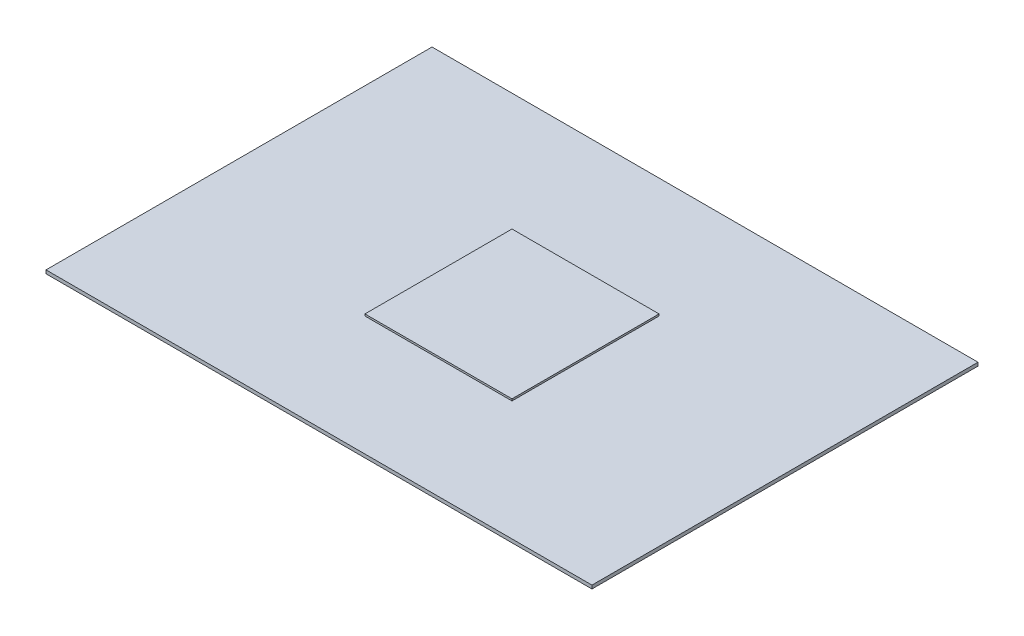
ISO-10303-21;
HEADER;
FILE_DESCRIPTION(('STEP AP214'),'2;1');
FILE_NAME('part.step','',(''),(''),'','','');
FILE_SCHEMA(('AUTOMOTIVE_DESIGN { 1 0 10303 214 1 1 1 1 }'));
ENDSEC;
DATA;
#1=APPLICATION_CONTEXT('core data for automotive mechanical design processes');
#2=APPLICATION_PROTOCOL_DEFINITION('international standard','automotive_design',2000,#1);
#3=PRODUCT_CONTEXT('',#1,'mechanical');
#4=PRODUCT('Part','Part','',(#3));
#5=PRODUCT_RELATED_PRODUCT_CATEGORY('part','',(#4));
#6=PRODUCT_DEFINITION_FORMATION('','',#4);
#7=PRODUCT_DEFINITION_CONTEXT('part definition',#1,'design');
#8=PRODUCT_DEFINITION('design','',#6,#7);
#9=PRODUCT_DEFINITION_SHAPE('','',#8);
#10=(LENGTH_UNIT() NAMED_UNIT(*) SI_UNIT(.MILLI.,.METRE.));
#11=(NAMED_UNIT(*) PLANE_ANGLE_UNIT() SI_UNIT($,.RADIAN.));
#12=(NAMED_UNIT(*) SI_UNIT($,.STERADIAN.) SOLID_ANGLE_UNIT());
#13=UNCERTAINTY_MEASURE_WITH_UNIT(LENGTH_MEASURE(1.E-05),#10,'distance_accuracy_value','');
#14=(GEOMETRIC_REPRESENTATION_CONTEXT(3) GLOBAL_UNCERTAINTY_ASSIGNED_CONTEXT((#13)) GLOBAL_UNIT_ASSIGNED_CONTEXT((#10,
#11,#12)) REPRESENTATION_CONTEXT('',''));
#15=CARTESIAN_POINT('',(0.,0.,0.));
#16=DIRECTION('',(0.,0.,1.));
#17=DIRECTION('',(1.,0.,0.));
#18=AXIS2_PLACEMENT_3D('',#15,#16,#17);
#19=CARTESIAN_POINT('',(0.,1.85176875818718,0.));
#20=DIRECTION('',(0.,-1.,0.));
#21=DIRECTION('',(0.,0.,-1.));
#22=AXIS2_PLACEMENT_3D('',#19,#20,#21);
#23=PLANE('',#22);
#24=DIRECTION('',(0.,0.,-1.));
#25=VECTOR('',#24,1.);
#26=CARTESIAN_POINT('',(148.5,1.85176875818718,105.));
#27=LINE('',#26,#25);
#28=CARTESIAN_POINT('',(148.5,1.85176875818718,105.));
#29=VERTEX_POINT('',#28);
#30=CARTESIAN_POINT('',(148.5,1.85176875818718,-105.));
#31=VERTEX_POINT('',#30);
#32=EDGE_CURVE('E145',#29,#31,#27,.T.);
#33=ORIENTED_EDGE('',*,*,#32,.T.);
#34=DIRECTION('',(-1.,0.,0.));
#35=VECTOR('',#34,1.);
#36=CARTESIAN_POINT('',(-148.5,1.85176875818718,-105.));
#37=LINE('',#36,#35);
#38=CARTESIAN_POINT('',(-148.5,1.85176875818718,-105.));
#39=VERTEX_POINT('',#38);
#40=EDGE_CURVE('E149',#31,#39,#37,.T.);
#41=ORIENTED_EDGE('',*,*,#40,.T.);
#42=DIRECTION('',(0.,0.,1.));
#43=VECTOR('',#42,1.);
#44=CARTESIAN_POINT('',(-148.5,1.85176875818718,105.));
#45=LINE('',#44,#43);
#46=CARTESIAN_POINT('',(-148.5,1.85176875818718,105.));
#47=VERTEX_POINT('',#46);
#48=EDGE_CURVE('E153',#39,#47,#45,.T.);
#49=ORIENTED_EDGE('',*,*,#48,.T.);
#50=DIRECTION('',(1.,0.,0.));
#51=VECTOR('',#50,1.);
#52=CARTESIAN_POINT('',(-148.5,1.85176875818718,105.));
#53=LINE('',#52,#51);
#54=EDGE_CURVE('E156',#47,#29,#53,.T.);
#55=ORIENTED_EDGE('',*,*,#54,.T.);
#56=EDGE_LOOP('',(#33,#41,#49,#55));
#57=FACE_BOUND('',#56,.T.);
#58=DIRECTION('',(0.,0.,-1.));
#59=VECTOR('',#58,1.);
#60=CARTESIAN_POINT('',(40.,1.85176875818718,40.));
#61=LINE('',#60,#59);
#62=CARTESIAN_POINT('',(40.,1.85176875818718,40.));
#63=VERTEX_POINT('',#62);
#64=CARTESIAN_POINT('',(40.,1.85176875818718,-40.));
#65=VERTEX_POINT('',#64);
#66=EDGE_CURVE('E61',#63,#65,#61,.T.);
#67=ORIENTED_EDGE('',*,*,#66,.F.);
#68=DIRECTION('',(1.,0.,0.));
#69=VECTOR('',#68,1.);
#70=CARTESIAN_POINT('',(-40.,1.85176875818718,40.));
#71=LINE('',#70,#69);
#72=CARTESIAN_POINT('',(-40.,1.85176875818718,40.));
#73=VERTEX_POINT('',#72);
#74=EDGE_CURVE('E65',#73,#63,#71,.T.);
#75=ORIENTED_EDGE('',*,*,#74,.F.);
#76=DIRECTION('',(0.,0.,1.));
#77=VECTOR('',#76,1.);
#78=CARTESIAN_POINT('',(-40.,1.85176875818718,40.));
#79=LINE('',#78,#77);
#80=CARTESIAN_POINT('',(-40.,1.85176875818718,-40.));
#81=VERTEX_POINT('',#80);
#82=EDGE_CURVE('E313',#81,#73,#79,.T.);
#83=ORIENTED_EDGE('',*,*,#82,.F.);
#84=DIRECTION('',(-1.,0.,0.));
#85=VECTOR('',#84,1.);
#86=CARTESIAN_POINT('',(-40.,1.85176875818718,-40.));
#87=LINE('',#86,#85);
#88=EDGE_CURVE('E323',#65,#81,#87,.T.);
#89=ORIENTED_EDGE('',*,*,#88,.F.);
#90=EDGE_LOOP('',(#67,#75,#83,#89));
#91=FACE_BOUND('',#90,.T.);
#92=ADVANCED_FACE('F45',(#57,#91),#23,.F.);
#93=CARTESIAN_POINT('',(148.5,1.85176875818718,105.));
#94=DIRECTION('',(-1.,0.,0.));
#95=DIRECTION('',(0.,0.,1.));
#96=AXIS2_PLACEMENT_3D('',#93,#94,#95);
#97=PLANE('',#96);
#98=DIRECTION('',(0.,0.,-1.));
#99=VECTOR('',#98,1.);
#100=CARTESIAN_POINT('',(148.5,0.,105.));
#101=LINE('',#100,#99);
#102=CARTESIAN_POINT('',(148.5,0.,105.));
#103=VERTEX_POINT('',#102);
#104=CARTESIAN_POINT('',(148.5,0.,-105.));
#105=VERTEX_POINT('',#104);
#106=EDGE_CURVE('E134',#103,#105,#101,.T.);
#107=ORIENTED_EDGE('',*,*,#106,.T.);
#108=DIRECTION('',(0.,-1.,0.));
#109=VECTOR('',#108,1.);
#110=CARTESIAN_POINT('',(148.5,1.85176875818718,-105.));
#111=LINE('',#110,#109);
#112=EDGE_CURVE('E11',#31,#105,#111,.T.);
#113=ORIENTED_EDGE('',*,*,#112,.F.);
#114=ORIENTED_EDGE('',*,*,#32,.F.);
#115=DIRECTION('',(0.,-1.,0.));
#116=VECTOR('',#115,1.);
#117=CARTESIAN_POINT('',(148.5,1.85176875818718,105.));
#118=LINE('',#117,#116);
#119=EDGE_CURVE('E158',#29,#103,#118,.T.);
#120=ORIENTED_EDGE('',*,*,#119,.T.);
#121=EDGE_LOOP('',(#107,#113,#114,#120));
#122=FACE_BOUND('',#121,.T.);
#123=ADVANCED_FACE('F47',(#122),#97,.F.);
#124=CARTESIAN_POINT('',(-148.5,1.85176875818718,-105.));
#125=DIRECTION('',(0.,0.,1.));
#126=DIRECTION('',(1.,0.,0.));
#127=AXIS2_PLACEMENT_3D('',#124,#125,#126);
#128=PLANE('',#127);
#129=DIRECTION('',(-1.,0.,0.));
#130=VECTOR('',#129,1.);
#131=CARTESIAN_POINT('',(-148.5,0.,-105.));
#132=LINE('',#131,#130);
#133=CARTESIAN_POINT('',(-148.5,0.,-105.));
#134=VERTEX_POINT('',#133);
#135=EDGE_CURVE('E139',#105,#134,#132,.T.);
#136=ORIENTED_EDGE('',*,*,#135,.T.);
#137=DIRECTION('',(0.,-1.,0.));
#138=VECTOR('',#137,1.);
#139=CARTESIAN_POINT('',(-148.5,1.85176875818718,-105.));
#140=LINE('',#139,#138);
#141=EDGE_CURVE('E54',#39,#134,#140,.T.);
#142=ORIENTED_EDGE('',*,*,#141,.F.);
#143=ORIENTED_EDGE('',*,*,#40,.F.);
#144=ORIENTED_EDGE('',*,*,#112,.T.);
#145=EDGE_LOOP('',(#136,#142,#143,#144));
#146=FACE_BOUND('',#145,.T.);
#147=ADVANCED_FACE('F194',(#146),#128,.F.);
#148=CARTESIAN_POINT('',(-148.5,1.85176875818718,105.));
#149=DIRECTION('',(1.,0.,0.));
#150=DIRECTION('',(0.,0.,-1.));
#151=AXIS2_PLACEMENT_3D('',#148,#149,#150);
#152=PLANE('',#151);
#153=DIRECTION('',(0.,0.,1.));
#154=VECTOR('',#153,1.);
#155=CARTESIAN_POINT('',(-148.5,0.,105.));
#156=LINE('',#155,#154);
#157=CARTESIAN_POINT('',(-148.5,0.,105.));
#158=VERTEX_POINT('',#157);
#159=EDGE_CURVE('E162',#134,#158,#156,.T.);
#160=ORIENTED_EDGE('',*,*,#159,.T.);
#161=DIRECTION('',(0.,-1.,0.));
#162=VECTOR('',#161,1.);
#163=CARTESIAN_POINT('',(-148.5,1.85176875818718,105.));
#164=LINE('',#163,#162);
#165=EDGE_CURVE('E170',#47,#158,#164,.T.);
#166=ORIENTED_EDGE('',*,*,#165,.F.);
#167=ORIENTED_EDGE('',*,*,#48,.F.);
#168=ORIENTED_EDGE('',*,*,#141,.T.);
#169=EDGE_LOOP('',(#160,#166,#167,#168));
#170=FACE_BOUND('',#169,.T.);
#171=ADVANCED_FACE('F179',(#170),#152,.F.);
#172=CARTESIAN_POINT('',(-148.5,1.85176875818718,105.));
#173=DIRECTION('',(0.,0.,-1.));
#174=DIRECTION('',(-1.,0.,0.));
#175=AXIS2_PLACEMENT_3D('',#172,#173,#174);
#176=PLANE('',#175);
#177=DIRECTION('',(1.,0.,0.));
#178=VECTOR('',#177,1.);
#179=CARTESIAN_POINT('',(-148.5,0.,105.));
#180=LINE('',#179,#178);
#181=EDGE_CURVE('E150',#158,#103,#180,.T.);
#182=ORIENTED_EDGE('',*,*,#181,.T.);
#183=ORIENTED_EDGE('',*,*,#119,.F.);
#184=ORIENTED_EDGE('',*,*,#54,.F.);
#185=ORIENTED_EDGE('',*,*,#165,.T.);
#186=EDGE_LOOP('',(#182,#183,#184,#185));
#187=FACE_BOUND('',#186,.T.);
#188=ADVANCED_FACE('F188',(#187),#176,.F.);
#189=CARTESIAN_POINT('',(0.,0.,0.));
#190=DIRECTION('',(0.,-1.,0.));
#191=DIRECTION('',(0.,0.,-1.));
#192=AXIS2_PLACEMENT_3D('',#189,#190,#191);
#193=PLANE('',#192);
#194=ORIENTED_EDGE('',*,*,#106,.F.);
#195=ORIENTED_EDGE('',*,*,#181,.F.);
#196=ORIENTED_EDGE('',*,*,#159,.F.);
#197=ORIENTED_EDGE('',*,*,#135,.F.);
#198=EDGE_LOOP('',(#194,#195,#196,#197));
#199=FACE_BOUND('',#198,.T.);
#200=ADVANCED_FACE('F185',(#199),#193,.T.);
#201=CARTESIAN_POINT('',(40.,2.85176875818718,40.));
#202=DIRECTION('',(-1.,0.,0.));
#203=DIRECTION('',(0.,0.,1.));
#204=AXIS2_PLACEMENT_3D('',#201,#202,#203);
#205=PLANE('',#204);
#206=ORIENTED_EDGE('',*,*,#66,.T.);
#207=DIRECTION('',(0.,-1.,0.));
#208=VECTOR('',#207,1.);
#209=CARTESIAN_POINT('',(40.,2.85176875818718,-40.));
#210=LINE('',#209,#208);
#211=CARTESIAN_POINT('',(40.,2.85176875818718,-40.));
#212=VERTEX_POINT('',#211);
#213=EDGE_CURVE('E114',#212,#65,#210,.T.);
#214=ORIENTED_EDGE('',*,*,#213,.F.);
#215=DIRECTION('',(0.,0.,-1.));
#216=VECTOR('',#215,1.);
#217=CARTESIAN_POINT('',(40.,2.85176875818718,40.));
#218=LINE('',#217,#216);
#219=CARTESIAN_POINT('',(40.,2.85176875818718,40.));
#220=VERTEX_POINT('',#219);
#221=EDGE_CURVE('E121',#220,#212,#218,.T.);
#222=ORIENTED_EDGE('',*,*,#221,.F.);
#223=DIRECTION('',(0.,-1.,0.));
#224=VECTOR('',#223,1.);
#225=CARTESIAN_POINT('',(40.,2.85176875818718,40.));
#226=LINE('',#225,#224);
#227=EDGE_CURVE('E310',#220,#63,#226,.T.);
#228=ORIENTED_EDGE('',*,*,#227,.T.);
#229=EDGE_LOOP('',(#206,#214,#222,#228));
#230=FACE_BOUND('',#229,.T.);
#231=ADVANCED_FACE('F132',(#230),#205,.F.);
#232=CARTESIAN_POINT('',(-40.,2.85176875818718,-40.));
#233=DIRECTION('',(0.,0.,1.));
#234=DIRECTION('',(1.,0.,0.));
#235=AXIS2_PLACEMENT_3D('',#232,#233,#234);
#236=PLANE('',#235);
#237=ORIENTED_EDGE('',*,*,#88,.T.);
#238=DIRECTION('',(0.,-1.,0.));
#239=VECTOR('',#238,1.);
#240=CARTESIAN_POINT('',(-40.,2.85176875818718,-40.));
#241=LINE('',#240,#239);
#242=CARTESIAN_POINT('',(-40.,2.85176875818718,-40.));
#243=VERTEX_POINT('',#242);
#244=EDGE_CURVE('E116',#243,#81,#241,.T.);
#245=ORIENTED_EDGE('',*,*,#244,.F.);
#246=DIRECTION('',(-1.,0.,0.));
#247=VECTOR('',#246,1.);
#248=CARTESIAN_POINT('',(-40.,2.85176875818718,-40.));
#249=LINE('',#248,#247);
#250=EDGE_CURVE('E109',#212,#243,#249,.T.);
#251=ORIENTED_EDGE('',*,*,#250,.F.);
#252=ORIENTED_EDGE('',*,*,#213,.T.);
#253=EDGE_LOOP('',(#237,#245,#251,#252));
#254=FACE_BOUND('',#253,.T.);
#255=ADVANCED_FACE('F112',(#254),#236,.F.);
#256=CARTESIAN_POINT('',(-40.,2.85176875818718,40.));
#257=DIRECTION('',(1.,0.,0.));
#258=DIRECTION('',(0.,0.,-1.));
#259=AXIS2_PLACEMENT_3D('',#256,#257,#258);
#260=PLANE('',#259);
#261=ORIENTED_EDGE('',*,*,#82,.T.);
#262=DIRECTION('',(0.,-1.,0.));
#263=VECTOR('',#262,1.);
#264=CARTESIAN_POINT('',(-40.,2.85176875818718,40.));
#265=LINE('',#264,#263);
#266=CARTESIAN_POINT('',(-40.,2.85176875818718,40.));
#267=VERTEX_POINT('',#266);
#268=EDGE_CURVE('E141',#267,#73,#265,.T.);
#269=ORIENTED_EDGE('',*,*,#268,.F.);
#270=DIRECTION('',(0.,0.,1.));
#271=VECTOR('',#270,1.);
#272=CARTESIAN_POINT('',(-40.,2.85176875818718,40.));
#273=LINE('',#272,#271);
#274=EDGE_CURVE('E120',#243,#267,#273,.T.);
#275=ORIENTED_EDGE('',*,*,#274,.F.);
#276=ORIENTED_EDGE('',*,*,#244,.T.);
#277=EDGE_LOOP('',(#261,#269,#275,#276));
#278=FACE_BOUND('',#277,.T.);
#279=ADVANCED_FACE('F230',(#278),#260,.F.);
#280=CARTESIAN_POINT('',(-40.,2.85176875818718,40.));
#281=DIRECTION('',(0.,0.,-1.));
#282=DIRECTION('',(-1.,0.,0.));
#283=AXIS2_PLACEMENT_3D('',#280,#281,#282);
#284=PLANE('',#283);
#285=ORIENTED_EDGE('',*,*,#74,.T.);
#286=ORIENTED_EDGE('',*,*,#227,.F.);
#287=DIRECTION('',(1.,0.,0.));
#288=VECTOR('',#287,1.);
#289=CARTESIAN_POINT('',(-40.,2.85176875818718,40.));
#290=LINE('',#289,#288);
#291=EDGE_CURVE('E126',#267,#220,#290,.T.);
#292=ORIENTED_EDGE('',*,*,#291,.F.);
#293=ORIENTED_EDGE('',*,*,#268,.T.);
#294=EDGE_LOOP('',(#285,#286,#292,#293));
#295=FACE_BOUND('',#294,.T.);
#296=ADVANCED_FACE('F236',(#295),#284,.F.);
#297=CARTESIAN_POINT('',(0.,2.85176875818718,0.));
#298=DIRECTION('',(0.,-1.,0.));
#299=DIRECTION('',(0.,0.,-1.));
#300=AXIS2_PLACEMENT_3D('',#297,#298,#299);
#301=PLANE('',#300);
#302=ORIENTED_EDGE('',*,*,#221,.T.);
#303=ORIENTED_EDGE('',*,*,#250,.T.);
#304=ORIENTED_EDGE('',*,*,#274,.T.);
#305=ORIENTED_EDGE('',*,*,#291,.T.);
#306=EDGE_LOOP('',(#302,#303,#304,#305));
#307=FACE_BOUND('',#306,.T.);
#308=ADVANCED_FACE('F124',(#307),#301,.F.);
#309=CLOSED_SHELL('',(#92,#123,#147,#171,#188,#200,#231,#255,#279,#296,#308));
#310=MANIFOLD_SOLID_BREP('B2',#309);
#311=ADVANCED_BREP_SHAPE_REPRESENTATION('',(#18,#310),#14);
#312=SHAPE_DEFINITION_REPRESENTATION(#9,#311);
ENDSEC;
END-ISO-10303-21;
